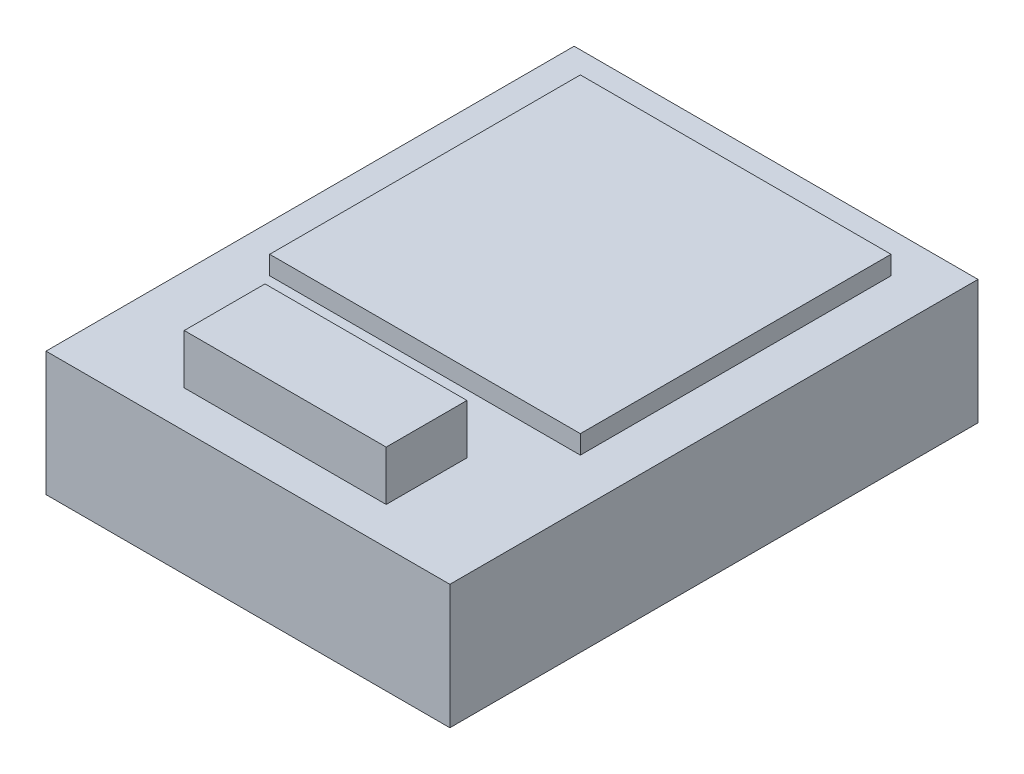
ISO-10303-21;
HEADER;
FILE_DESCRIPTION(('STEP AP214'),'2;1');
FILE_NAME('part.step','',(''),(''),'','','');
FILE_SCHEMA(('AUTOMOTIVE_DESIGN { 1 0 10303 214 1 1 1 1 }'));
ENDSEC;
DATA;
#1=APPLICATION_CONTEXT('core data for automotive mechanical design processes');
#2=APPLICATION_PROTOCOL_DEFINITION('international standard','automotive_design',2000,#1);
#3=PRODUCT_CONTEXT('',#1,'mechanical');
#4=PRODUCT('Part','Part','',(#3));
#5=PRODUCT_RELATED_PRODUCT_CATEGORY('part','',(#4));
#6=PRODUCT_DEFINITION_FORMATION('','',#4);
#7=PRODUCT_DEFINITION_CONTEXT('part definition',#1,'design');
#8=PRODUCT_DEFINITION('design','',#6,#7);
#9=PRODUCT_DEFINITION_SHAPE('','',#8);
#10=(LENGTH_UNIT() NAMED_UNIT(*) SI_UNIT(.MILLI.,.METRE.));
#11=(NAMED_UNIT(*) PLANE_ANGLE_UNIT() SI_UNIT($,.RADIAN.));
#12=(NAMED_UNIT(*) SI_UNIT($,.STERADIAN.) SOLID_ANGLE_UNIT());
#13=UNCERTAINTY_MEASURE_WITH_UNIT(LENGTH_MEASURE(1.E-05),#10,'distance_accuracy_value','');
#14=(GEOMETRIC_REPRESENTATION_CONTEXT(3) GLOBAL_UNCERTAINTY_ASSIGNED_CONTEXT((#13)) GLOBAL_UNIT_ASSIGNED_CONTEXT((#10,
#11,#12)) REPRESENTATION_CONTEXT('',''));
#15=CARTESIAN_POINT('',(0.,0.,0.));
#16=DIRECTION('',(0.,0.,1.));
#17=DIRECTION('',(1.,0.,0.));
#18=AXIS2_PLACEMENT_3D('',#15,#16,#17);
#19=CARTESIAN_POINT('',(-0.418925831202045,0.5,-0.867774936061381));
#20=DIRECTION('',(1.,0.,0.));
#21=DIRECTION('',(0.,0.,-1.));
#22=AXIS2_PLACEMENT_3D('',#19,#20,#21);
#23=PLANE('',#22);
#24=DIRECTION('',(0.,0.,-1.));
#25=VECTOR('',#24,1.);
#26=CARTESIAN_POINT('',(-0.418925831202045,0.1,-0.867774936061381));
#27=LINE('',#26,#25);
#28=CARTESIAN_POINT('',(-0.418925831202045,0.1,0.832225063938618));
#29=VERTEX_POINT('',#28);
#30=CARTESIAN_POINT('',(-0.418925831202045,0.1,-0.867774936061381));
#31=VERTEX_POINT('',#30);
#32=EDGE_CURVE('E57',#29,#31,#27,.T.);
#33=ORIENTED_EDGE('',*,*,#32,.F.);
#34=DIRECTION('',(0.,-1.,0.));
#35=VECTOR('',#34,1.);
#36=CARTESIAN_POINT('',(-0.418925831202045,0.5,0.832225063938618));
#37=LINE('',#36,#35);
#38=CARTESIAN_POINT('',(-0.418925831202045,0.5,0.832225063938618));
#39=VERTEX_POINT('',#38);
#40=EDGE_CURVE('E49',#39,#29,#37,.T.);
#41=ORIENTED_EDGE('',*,*,#40,.F.);
#42=DIRECTION('',(0.,0.,1.));
#43=VECTOR('',#42,1.);
#44=CARTESIAN_POINT('',(-0.418925831202045,0.5,-0.867774936061381));
#45=LINE('',#44,#43);
#46=CARTESIAN_POINT('',(-0.418925831202045,0.5,-0.867774936061381));
#47=VERTEX_POINT('',#46);
#48=EDGE_CURVE('E317',#47,#39,#45,.T.);
#49=ORIENTED_EDGE('',*,*,#48,.F.);
#50=DIRECTION('',(0.,-1.,0.));
#51=VECTOR('',#50,1.);
#52=CARTESIAN_POINT('',(-0.418925831202045,0.5,-0.867774936061381));
#53=LINE('',#52,#51);
#54=EDGE_CURVE('E327',#47,#31,#53,.T.);
#55=ORIENTED_EDGE('',*,*,#54,.T.);
#56=EDGE_LOOP('',(#33,#41,#49,#55));
#57=FACE_BOUND('',#56,.T.);
#58=ADVANCED_FACE('F43',(#57),#23,.F.);
#59=CARTESIAN_POINT('',(-0.418925831202045,0.5,0.832225063938618));
#60=DIRECTION('',(0.,0.,-1.));
#61=DIRECTION('',(-1.,0.,0.));
#62=AXIS2_PLACEMENT_3D('',#59,#60,#61);
#63=PLANE('',#62);
#64=DIRECTION('',(-1.,0.,0.));
#65=VECTOR('',#64,1.);
#66=CARTESIAN_POINT('',(-0.418925831202045,0.1,0.832225063938618));
#67=LINE('',#66,#65);
#68=CARTESIAN_POINT('',(0.881074168797955,0.1,0.832225063938618));
#69=VERTEX_POINT('',#68);
#70=EDGE_CURVE('E255',#69,#29,#67,.T.);
#71=ORIENTED_EDGE('',*,*,#70,.F.);
#72=DIRECTION('',(0.,-1.,0.));
#73=VECTOR('',#72,1.);
#74=CARTESIAN_POINT('',(0.881074168797955,0.5,0.832225063938618));
#75=LINE('',#74,#73);
#76=CARTESIAN_POINT('',(0.881074168797955,0.5,0.832225063938618));
#77=VERTEX_POINT('',#76);
#78=EDGE_CURVE('E331',#77,#69,#75,.T.);
#79=ORIENTED_EDGE('',*,*,#78,.F.);
#80=DIRECTION('',(1.,0.,0.));
#81=VECTOR('',#80,1.);
#82=CARTESIAN_POINT('',(-0.418925831202045,0.5,0.832225063938618));
#83=LINE('',#82,#81);
#84=EDGE_CURVE('E325',#39,#77,#83,.T.);
#85=ORIENTED_EDGE('',*,*,#84,.F.);
#86=ORIENTED_EDGE('',*,*,#40,.T.);
#87=EDGE_LOOP('',(#71,#79,#85,#86));
#88=FACE_BOUND('',#87,.T.);
#89=ADVANCED_FACE('F337',(#88),#63,.F.);
#90=CARTESIAN_POINT('',(0.881074168797955,0.5,-0.867774936061381));
#91=DIRECTION('',(-1.,0.,0.));
#92=DIRECTION('',(0.,0.,1.));
#93=AXIS2_PLACEMENT_3D('',#90,#91,#92);
#94=PLANE('',#93);
#95=DIRECTION('',(0.,0.,1.));
#96=VECTOR('',#95,1.);
#97=CARTESIAN_POINT('',(0.881074168797955,0.1,-0.867774936061381));
#98=LINE('',#97,#96);
#99=CARTESIAN_POINT('',(0.881074168797955,0.1,-0.867774936061381));
#100=VERTEX_POINT('',#99);
#101=EDGE_CURVE('E249',#100,#69,#98,.T.);
#102=ORIENTED_EDGE('',*,*,#101,.F.);
#103=DIRECTION('',(0.,-1.,0.));
#104=VECTOR('',#103,1.);
#105=CARTESIAN_POINT('',(0.881074168797955,0.5,-0.867774936061381));
#106=LINE('',#105,#104);
#107=CARTESIAN_POINT('',(0.881074168797955,0.5,-0.867774936061381));
#108=VERTEX_POINT('',#107);
#109=EDGE_CURVE('E332',#108,#100,#106,.T.);
#110=ORIENTED_EDGE('',*,*,#109,.F.);
#111=DIRECTION('',(0.,0.,-1.));
#112=VECTOR('',#111,1.);
#113=CARTESIAN_POINT('',(0.881074168797955,0.5,-0.867774936061381));
#114=LINE('',#113,#112);
#115=EDGE_CURVE('E322',#77,#108,#114,.T.);
#116=ORIENTED_EDGE('',*,*,#115,.F.);
#117=ORIENTED_EDGE('',*,*,#78,.T.);
#118=EDGE_LOOP('',(#102,#110,#116,#117));
#119=FACE_BOUND('',#118,.T.);
#120=ADVANCED_FACE('F354',(#119),#94,.F.);
#121=CARTESIAN_POINT('',(-0.418925831202045,0.5,-0.867774936061381));
#122=DIRECTION('',(0.,0.,1.));
#123=DIRECTION('',(1.,0.,0.));
#124=AXIS2_PLACEMENT_3D('',#121,#122,#123);
#125=PLANE('',#124);
#126=DIRECTION('',(1.,0.,0.));
#127=VECTOR('',#126,1.);
#128=CARTESIAN_POINT('',(-0.418925831202045,0.1,-0.867774936061381));
#129=LINE('',#128,#127);
#130=EDGE_CURVE('E11',#31,#100,#129,.T.);
#131=ORIENTED_EDGE('',*,*,#130,.F.);
#132=ORIENTED_EDGE('',*,*,#54,.F.);
#133=DIRECTION('',(-1.,0.,0.));
#134=VECTOR('',#133,1.);
#135=CARTESIAN_POINT('',(-0.418925831202045,0.5,-0.867774936061381));
#136=LINE('',#135,#134);
#137=EDGE_CURVE('E326',#108,#47,#136,.T.);
#138=ORIENTED_EDGE('',*,*,#137,.F.);
#139=ORIENTED_EDGE('',*,*,#109,.T.);
#140=EDGE_LOOP('',(#131,#132,#138,#139));
#141=FACE_BOUND('',#140,.T.);
#142=ADVANCED_FACE('F350',(#141),#125,.F.);
#143=CARTESIAN_POINT('',(0.,0.5,0.));
#144=DIRECTION('',(0.,1.,0.));
#145=DIRECTION('',(0.,0.,1.));
#146=AXIS2_PLACEMENT_3D('',#143,#144,#145);
#147=PLANE('',#146);
#148=DIRECTION('',(0.,0.,1.));
#149=VECTOR('',#148,1.);
#150=CARTESIAN_POINT('',(-0.268925831202045,0.5,-0.737774936061381));
#151=LINE('',#150,#149);
#152=CARTESIAN_POINT('',(-0.268925831202045,0.5,-0.737774936061381));
#153=VERTEX_POINT('',#152);
#154=CARTESIAN_POINT('',(-0.268925831202045,0.5,0.262225063938619));
#155=VERTEX_POINT('',#154);
#156=EDGE_CURVE('E288',#153,#155,#151,.T.);
#157=ORIENTED_EDGE('',*,*,#156,.F.);
#158=DIRECTION('',(-1.,0.,0.));
#159=VECTOR('',#158,1.);
#160=CARTESIAN_POINT('',(-0.268925831202045,0.5,-0.737774936061381));
#161=LINE('',#160,#159);
#162=CARTESIAN_POINT('',(0.731074168797955,0.5,-0.737774936061381));
#163=VERTEX_POINT('',#162);
#164=EDGE_CURVE('E292',#163,#153,#161,.T.);
#165=ORIENTED_EDGE('',*,*,#164,.F.);
#166=DIRECTION('',(0.,0.,-1.));
#167=VECTOR('',#166,1.);
#168=CARTESIAN_POINT('',(0.731074168797955,0.5,-0.737774936061381));
#169=LINE('',#168,#167);
#170=CARTESIAN_POINT('',(0.731074168797955,0.5,0.262225063938619));
#171=VERTEX_POINT('',#170);
#172=EDGE_CURVE('E302',#171,#163,#169,.T.);
#173=ORIENTED_EDGE('',*,*,#172,.F.);
#174=DIRECTION('',(1.,0.,0.));
#175=VECTOR('',#174,1.);
#176=CARTESIAN_POINT('',(-0.268925831202045,0.5,0.262225063938619));
#177=LINE('',#176,#175);
#178=EDGE_CURVE('E297',#155,#171,#177,.T.);
#179=ORIENTED_EDGE('',*,*,#178,.F.);
#180=EDGE_LOOP('',(#157,#165,#173,#179));
#181=FACE_BOUND('',#180,.T.);
#182=ORIENTED_EDGE('',*,*,#48,.T.);
#183=ORIENTED_EDGE('',*,*,#84,.T.);
#184=ORIENTED_EDGE('',*,*,#115,.T.);
#185=ORIENTED_EDGE('',*,*,#137,.T.);
#186=EDGE_LOOP('',(#182,#183,#184,#185));
#187=FACE_BOUND('',#186,.T.);
#188=DIRECTION('',(1.,0.,0.));
#189=VECTOR('',#188,1.);
#190=CARTESIAN_POINT('',(-0.0939258312020454,0.5,0.712225063938618));
#191=LINE('',#190,#189);
#192=CARTESIAN_POINT('',(-0.0939258312020454,0.5,0.712225063938618));
#193=VERTEX_POINT('',#192);
#194=CARTESIAN_POINT('',(0.556074168797955,0.5,0.712225063938618));
#195=VERTEX_POINT('',#194);
#196=EDGE_CURVE('E271',#193,#195,#191,.T.);
#197=ORIENTED_EDGE('',*,*,#196,.F.);
#198=DIRECTION('',(0.,0.,1.));
#199=VECTOR('',#198,1.);
#200=CARTESIAN_POINT('',(-0.0939258312020454,0.5,0.452225063938618));
#201=LINE('',#200,#199);
#202=CARTESIAN_POINT('',(-0.0939258312020454,0.5,0.452225063938618));
#203=VERTEX_POINT('',#202);
#204=EDGE_CURVE('E260',#203,#193,#201,.T.);
#205=ORIENTED_EDGE('',*,*,#204,.F.);
#206=DIRECTION('',(-1.,0.,0.));
#207=VECTOR('',#206,1.);
#208=CARTESIAN_POINT('',(-0.0939258312020454,0.5,0.452225063938618));
#209=LINE('',#208,#207);
#210=CARTESIAN_POINT('',(0.556074168797955,0.5,0.452225063938618));
#211=VERTEX_POINT('',#210);
#212=EDGE_CURVE('E265',#211,#203,#209,.T.);
#213=ORIENTED_EDGE('',*,*,#212,.F.);
#214=DIRECTION('',(0.,0.,-1.));
#215=VECTOR('',#214,1.);
#216=CARTESIAN_POINT('',(0.556074168797955,0.5,0.452225063938618));
#217=LINE('',#216,#215);
#218=EDGE_CURVE('E272',#195,#211,#217,.T.);
#219=ORIENTED_EDGE('',*,*,#218,.F.);
#220=EDGE_LOOP('',(#197,#205,#213,#219));
#221=FACE_BOUND('',#220,.T.);
#222=ADVANCED_FACE('F353',(#181,#187,#221),#147,.T.);
#223=CARTESIAN_POINT('',(-0.268925831202045,0.56,-0.737774936061381));
#224=DIRECTION('',(1.,0.,0.));
#225=DIRECTION('',(0.,0.,-1.));
#226=AXIS2_PLACEMENT_3D('',#223,#224,#225);
#227=PLANE('',#226);
#228=ORIENTED_EDGE('',*,*,#156,.T.);
#229=DIRECTION('',(0.,-1.,0.));
#230=VECTOR('',#229,1.);
#231=CARTESIAN_POINT('',(-0.268925831202045,0.56,0.262225063938619));
#232=LINE('',#231,#230);
#233=CARTESIAN_POINT('',(-0.268925831202045,0.56,0.262225063938619));
#234=VERTEX_POINT('',#233);
#235=EDGE_CURVE('E316',#234,#155,#232,.T.);
#236=ORIENTED_EDGE('',*,*,#235,.F.);
#237=DIRECTION('',(0.,0.,1.));
#238=VECTOR('',#237,1.);
#239=CARTESIAN_POINT('',(-0.268925831202045,0.56,-0.737774936061381));
#240=LINE('',#239,#238);
#241=CARTESIAN_POINT('',(-0.268925831202045,0.56,-0.737774936061381));
#242=VERTEX_POINT('',#241);
#243=EDGE_CURVE('E289',#242,#234,#240,.T.);
#244=ORIENTED_EDGE('',*,*,#243,.F.);
#245=DIRECTION('',(0.,-1.,0.));
#246=VECTOR('',#245,1.);
#247=CARTESIAN_POINT('',(-0.268925831202045,0.56,-0.737774936061381));
#248=LINE('',#247,#246);
#249=EDGE_CURVE('E296',#242,#153,#248,.T.);
#250=ORIENTED_EDGE('',*,*,#249,.T.);
#251=EDGE_LOOP('',(#228,#236,#244,#250));
#252=FACE_BOUND('',#251,.T.);
#253=ADVANCED_FACE('F359',(#252),#227,.F.);
#254=CARTESIAN_POINT('',(-0.268925831202045,0.56,0.262225063938619));
#255=DIRECTION('',(0.,0.,-1.));
#256=DIRECTION('',(-1.,0.,0.));
#257=AXIS2_PLACEMENT_3D('',#254,#255,#256);
#258=PLANE('',#257);
#259=ORIENTED_EDGE('',*,*,#178,.T.);
#260=DIRECTION('',(0.,-1.,0.));
#261=VECTOR('',#260,1.);
#262=CARTESIAN_POINT('',(0.731074168797955,0.56,0.262225063938619));
#263=LINE('',#262,#261);
#264=CARTESIAN_POINT('',(0.731074168797955,0.56,0.262225063938619));
#265=VERTEX_POINT('',#264);
#266=EDGE_CURVE('E311',#265,#171,#263,.T.);
#267=ORIENTED_EDGE('',*,*,#266,.F.);
#268=DIRECTION('',(1.,0.,0.));
#269=VECTOR('',#268,1.);
#270=CARTESIAN_POINT('',(-0.268925831202045,0.56,0.262225063938619));
#271=LINE('',#270,#269);
#272=EDGE_CURVE('E286',#234,#265,#271,.T.);
#273=ORIENTED_EDGE('',*,*,#272,.F.);
#274=ORIENTED_EDGE('',*,*,#235,.T.);
#275=EDGE_LOOP('',(#259,#267,#273,#274));
#276=FACE_BOUND('',#275,.T.);
#277=ADVANCED_FACE('F410',(#276),#258,.F.);
#278=CARTESIAN_POINT('',(0.731074168797955,0.56,-0.737774936061381));
#279=DIRECTION('',(-1.,0.,0.));
#280=DIRECTION('',(0.,0.,1.));
#281=AXIS2_PLACEMENT_3D('',#278,#279,#280);
#282=PLANE('',#281);
#283=ORIENTED_EDGE('',*,*,#172,.T.);
#284=DIRECTION('',(0.,-1.,0.));
#285=VECTOR('',#284,1.);
#286=CARTESIAN_POINT('',(0.731074168797955,0.56,-0.737774936061381));
#287=LINE('',#286,#285);
#288=CARTESIAN_POINT('',(0.731074168797955,0.56,-0.737774936061381));
#289=VERTEX_POINT('',#288);
#290=EDGE_CURVE('E309',#289,#163,#287,.T.);
#291=ORIENTED_EDGE('',*,*,#290,.F.);
#292=DIRECTION('',(0.,0.,-1.));
#293=VECTOR('',#292,1.);
#294=CARTESIAN_POINT('',(0.731074168797955,0.56,-0.737774936061381));
#295=LINE('',#294,#293);
#296=EDGE_CURVE('E291',#265,#289,#295,.T.);
#297=ORIENTED_EDGE('',*,*,#296,.F.);
#298=ORIENTED_EDGE('',*,*,#266,.T.);
#299=EDGE_LOOP('',(#283,#291,#297,#298));
#300=FACE_BOUND('',#299,.T.);
#301=ADVANCED_FACE('F414',(#300),#282,.F.);
#302=CARTESIAN_POINT('',(-0.268925831202045,0.56,-0.737774936061381));
#303=DIRECTION('',(0.,0.,1.));
#304=DIRECTION('',(1.,0.,0.));
#305=AXIS2_PLACEMENT_3D('',#302,#303,#304);
#306=PLANE('',#305);
#307=ORIENTED_EDGE('',*,*,#164,.T.);
#308=ORIENTED_EDGE('',*,*,#249,.F.);
#309=DIRECTION('',(-1.,0.,0.));
#310=VECTOR('',#309,1.);
#311=CARTESIAN_POINT('',(-0.268925831202045,0.56,-0.737774936061381));
#312=LINE('',#311,#310);
#313=EDGE_CURVE('E293',#289,#242,#312,.T.);
#314=ORIENTED_EDGE('',*,*,#313,.F.);
#315=ORIENTED_EDGE('',*,*,#290,.T.);
#316=EDGE_LOOP('',(#307,#308,#314,#315));
#317=FACE_BOUND('',#316,.T.);
#318=ADVANCED_FACE('F418',(#317),#306,.F.);
#319=CARTESIAN_POINT('',(0.,0.56,0.));
#320=DIRECTION('',(0.,1.,0.));
#321=DIRECTION('',(0.,0.,1.));
#322=AXIS2_PLACEMENT_3D('',#319,#320,#321);
#323=PLANE('',#322);
#324=ORIENTED_EDGE('',*,*,#243,.T.);
#325=ORIENTED_EDGE('',*,*,#272,.T.);
#326=ORIENTED_EDGE('',*,*,#296,.T.);
#327=ORIENTED_EDGE('',*,*,#313,.T.);
#328=EDGE_LOOP('',(#324,#325,#326,#327));
#329=FACE_BOUND('',#328,.T.);
#330=ADVANCED_FACE('F419',(#329),#323,.T.);
#331=CARTESIAN_POINT('',(-0.0939258312020454,0.66,0.452225063938618));
#332=DIRECTION('',(1.,0.,0.));
#333=DIRECTION('',(0.,0.,-1.));
#334=AXIS2_PLACEMENT_3D('',#331,#332,#333);
#335=PLANE('',#334);
#336=ORIENTED_EDGE('',*,*,#204,.T.);
#337=DIRECTION('',(0.,-1.,0.));
#338=VECTOR('',#337,1.);
#339=CARTESIAN_POINT('',(-0.0939258312020454,0.66,0.712225063938618));
#340=LINE('',#339,#338);
#341=CARTESIAN_POINT('',(-0.0939258312020454,0.66,0.712225063938618));
#342=VERTEX_POINT('',#341);
#343=EDGE_CURVE('E283',#342,#193,#340,.T.);
#344=ORIENTED_EDGE('',*,*,#343,.F.);
#345=DIRECTION('',(0.,0.,1.));
#346=VECTOR('',#345,1.);
#347=CARTESIAN_POINT('',(-0.0939258312020454,0.66,0.452225063938618));
#348=LINE('',#347,#346);
#349=CARTESIAN_POINT('',(-0.0939258312020454,0.66,0.452225063938618));
#350=VERTEX_POINT('',#349);
#351=EDGE_CURVE('E256',#350,#342,#348,.T.);
#352=ORIENTED_EDGE('',*,*,#351,.F.);
#353=DIRECTION('',(0.,-1.,0.));
#354=VECTOR('',#353,1.);
#355=CARTESIAN_POINT('',(-0.0939258312020454,0.66,0.452225063938618));
#356=LINE('',#355,#354);
#357=EDGE_CURVE('E268',#350,#203,#356,.T.);
#358=ORIENTED_EDGE('',*,*,#357,.T.);
#359=EDGE_LOOP('',(#336,#344,#352,#358));
#360=FACE_BOUND('',#359,.T.);
#361=ADVANCED_FACE('F378',(#360),#335,.F.);
#362=CARTESIAN_POINT('',(-0.0939258312020454,0.66,0.712225063938618));
#363=DIRECTION('',(0.,0.,-1.));
#364=DIRECTION('',(-1.,0.,0.));
#365=AXIS2_PLACEMENT_3D('',#362,#363,#364);
#366=PLANE('',#365);
#367=ORIENTED_EDGE('',*,*,#196,.T.);
#368=DIRECTION('',(0.,-1.,0.));
#369=VECTOR('',#368,1.);
#370=CARTESIAN_POINT('',(0.556074168797955,0.66,0.712225063938618));
#371=LINE('',#370,#369);
#372=CARTESIAN_POINT('',(0.556074168797955,0.66,0.712225063938618));
#373=VERTEX_POINT('',#372);
#374=EDGE_CURVE('E284',#373,#195,#371,.T.);
#375=ORIENTED_EDGE('',*,*,#374,.F.);
#376=DIRECTION('',(1.,0.,0.));
#377=VECTOR('',#376,1.);
#378=CARTESIAN_POINT('',(-0.0939258312020454,0.66,0.712225063938618));
#379=LINE('',#378,#377);
#380=EDGE_CURVE('E261',#342,#373,#379,.T.);
#381=ORIENTED_EDGE('',*,*,#380,.F.);
#382=ORIENTED_EDGE('',*,*,#343,.T.);
#383=EDGE_LOOP('',(#367,#375,#381,#382));
#384=FACE_BOUND('',#383,.T.);
#385=ADVANCED_FACE('F368',(#384),#366,.F.);
#386=CARTESIAN_POINT('',(0.556074168797955,0.66,0.452225063938618));
#387=DIRECTION('',(-1.,0.,0.));
#388=DIRECTION('',(0.,0.,1.));
#389=AXIS2_PLACEMENT_3D('',#386,#387,#388);
#390=PLANE('',#389);
#391=ORIENTED_EDGE('',*,*,#218,.T.);
#392=DIRECTION('',(0.,-1.,0.));
#393=VECTOR('',#392,1.);
#394=CARTESIAN_POINT('',(0.556074168797955,0.66,0.452225063938618));
#395=LINE('',#394,#393);
#396=CARTESIAN_POINT('',(0.556074168797955,0.66,0.452225063938618));
#397=VERTEX_POINT('',#396);
#398=EDGE_CURVE('E276',#397,#211,#395,.T.);
#399=ORIENTED_EDGE('',*,*,#398,.F.);
#400=DIRECTION('',(0.,0.,-1.));
#401=VECTOR('',#400,1.);
#402=CARTESIAN_POINT('',(0.556074168797955,0.66,0.452225063938618));
#403=LINE('',#402,#401);
#404=EDGE_CURVE('E262',#373,#397,#403,.T.);
#405=ORIENTED_EDGE('',*,*,#404,.F.);
#406=ORIENTED_EDGE('',*,*,#374,.T.);
#407=EDGE_LOOP('',(#391,#399,#405,#406));
#408=FACE_BOUND('',#407,.T.);
#409=ADVANCED_FACE('F367',(#408),#390,.F.);
#410=CARTESIAN_POINT('',(-0.0939258312020454,0.66,0.452225063938618));
#411=DIRECTION('',(0.,0.,1.));
#412=DIRECTION('',(1.,0.,0.));
#413=AXIS2_PLACEMENT_3D('',#410,#411,#412);
#414=PLANE('',#413);
#415=ORIENTED_EDGE('',*,*,#212,.T.);
#416=ORIENTED_EDGE('',*,*,#357,.F.);
#417=DIRECTION('',(-1.,0.,0.));
#418=VECTOR('',#417,1.);
#419=CARTESIAN_POINT('',(-0.0939258312020454,0.66,0.452225063938618));
#420=LINE('',#419,#418);
#421=EDGE_CURVE('E266',#397,#350,#420,.T.);
#422=ORIENTED_EDGE('',*,*,#421,.F.);
#423=ORIENTED_EDGE('',*,*,#398,.T.);
#424=EDGE_LOOP('',(#415,#416,#422,#423));
#425=FACE_BOUND('',#424,.T.);
#426=ADVANCED_FACE('F379',(#425),#414,.F.);
#427=CARTESIAN_POINT('',(0.,0.66,0.));
#428=DIRECTION('',(0.,1.,0.));
#429=DIRECTION('',(0.,0.,1.));
#430=AXIS2_PLACEMENT_3D('',#427,#428,#429);
#431=PLANE('',#430);
#432=ORIENTED_EDGE('',*,*,#351,.T.);
#433=ORIENTED_EDGE('',*,*,#380,.T.);
#434=ORIENTED_EDGE('',*,*,#404,.T.);
#435=ORIENTED_EDGE('',*,*,#421,.T.);
#436=EDGE_LOOP('',(#432,#433,#434,#435));
#437=FACE_BOUND('',#436,.T.);
#438=ADVANCED_FACE('F372',(#437),#431,.T.);
#439=CARTESIAN_POINT('',(0.,0.1,0.));
#440=DIRECTION('',(0.,-1.,0.));
#441=DIRECTION('',(0.,0.,-1.));
#442=AXIS2_PLACEMENT_3D('',#439,#440,#441);
#443=PLANE('',#442);
#444=DIRECTION('',(-1.,0.,0.));
#445=VECTOR('',#444,1.);
#446=CARTESIAN_POINT('',(-0.293925831202045,0.1,0.732225063938618));
#447=LINE('',#446,#445);
#448=CARTESIAN_POINT('',(0.106074168797955,0.1,0.732225063938618));
#449=VERTEX_POINT('',#448);
#450=CARTESIAN_POINT('',(-0.293925831202045,0.1,0.732225063938618));
#451=VERTEX_POINT('',#450);
#452=EDGE_CURVE('E232',#449,#451,#447,.T.);
#453=ORIENTED_EDGE('',*,*,#452,.F.);
#454=DIRECTION('',(0.,0.,1.));
#455=VECTOR('',#454,1.);
#456=CARTESIAN_POINT('',(0.106074168797955,0.1,0.732225063938618));
#457=LINE('',#456,#455);
#458=CARTESIAN_POINT('',(0.106074168797955,0.1,-0.767774936061382));
#459=VERTEX_POINT('',#458);
#460=EDGE_CURVE('E227',#459,#449,#457,.T.);
#461=ORIENTED_EDGE('',*,*,#460,.F.);
#462=DIRECTION('',(1.,0.,0.));
#463=VECTOR('',#462,1.);
#464=CARTESIAN_POINT('',(-0.293925831202045,0.1,-0.767774936061382));
#465=LINE('',#464,#463);
#466=CARTESIAN_POINT('',(-0.293925831202045,0.1,-0.767774936061382));
#467=VERTEX_POINT('',#466);
#468=EDGE_CURVE('E229',#467,#459,#465,.T.);
#469=ORIENTED_EDGE('',*,*,#468,.F.);
#470=DIRECTION('',(0.,0.,-1.));
#471=VECTOR('',#470,1.);
#472=CARTESIAN_POINT('',(-0.293925831202045,0.1,0.732225063938618));
#473=LINE('',#472,#471);
#474=EDGE_CURVE('E224',#451,#467,#473,.T.);
#475=ORIENTED_EDGE('',*,*,#474,.F.);
#476=EDGE_LOOP('',(#453,#461,#469,#475));
#477=FACE_BOUND('',#476,.T.);
#478=DIRECTION('',(-1.,0.,0.));
#479=VECTOR('',#478,1.);
#480=CARTESIAN_POINT('',(0.356074168797955,0.1,0.732225063938618));
#481=LINE('',#480,#479);
#482=CARTESIAN_POINT('',(0.756074168797955,0.1,0.732225063938618));
#483=VERTEX_POINT('',#482);
#484=CARTESIAN_POINT('',(0.356074168797955,0.1,0.732225063938618));
#485=VERTEX_POINT('',#484);
#486=EDGE_CURVE('E193',#483,#485,#481,.T.);
#487=ORIENTED_EDGE('',*,*,#486,.F.);
#488=DIRECTION('',(0.,0.,1.));
#489=VECTOR('',#488,1.);
#490=CARTESIAN_POINT('',(0.756074168797955,0.1,0.732225063938618));
#491=LINE('',#490,#489);
#492=CARTESIAN_POINT('',(0.756074168797955,0.1,-0.767774936061382));
#493=VERTEX_POINT('',#492);
#494=EDGE_CURVE('E199',#493,#483,#491,.T.);
#495=ORIENTED_EDGE('',*,*,#494,.F.);
#496=DIRECTION('',(1.,0.,0.));
#497=VECTOR('',#496,1.);
#498=CARTESIAN_POINT('',(0.356074168797955,0.1,-0.767774936061382));
#499=LINE('',#498,#497);
#500=CARTESIAN_POINT('',(0.356074168797955,0.1,-0.767774936061382));
#501=VERTEX_POINT('',#500);
#502=EDGE_CURVE('E181',#501,#493,#499,.T.);
#503=ORIENTED_EDGE('',*,*,#502,.F.);
#504=DIRECTION('',(0.,0.,-1.));
#505=VECTOR('',#504,1.);
#506=CARTESIAN_POINT('',(0.356074168797955,0.1,0.732225063938618));
#507=LINE('',#506,#505);
#508=EDGE_CURVE('E197',#485,#501,#507,.T.);
#509=ORIENTED_EDGE('',*,*,#508,.F.);
#510=EDGE_LOOP('',(#487,#495,#503,#509));
#511=FACE_BOUND('',#510,.T.);
#512=ORIENTED_EDGE('',*,*,#32,.T.);
#513=ORIENTED_EDGE('',*,*,#130,.T.);
#514=ORIENTED_EDGE('',*,*,#101,.T.);
#515=ORIENTED_EDGE('',*,*,#70,.T.);
#516=EDGE_LOOP('',(#512,#513,#514,#515));
#517=FACE_BOUND('',#516,.T.);
#518=ADVANCED_FACE('F198',(#477,#511,#517),#443,.T.);
#519=CARTESIAN_POINT('',(-0.293925831202045,0.1,0.732225063938618));
#520=DIRECTION('',(-1.,0.,0.));
#521=DIRECTION('',(0.,0.,1.));
#522=AXIS2_PLACEMENT_3D('',#519,#520,#521);
#523=PLANE('',#522);
#524=DIRECTION('',(0.,0.,-1.));
#525=VECTOR('',#524,1.);
#526=CARTESIAN_POINT('',(-0.293925831202045,0.,0.732225063938618));
#527=LINE('',#526,#525);
#528=CARTESIAN_POINT('',(-0.293925831202045,0.,0.732225063938618));
#529=VERTEX_POINT('',#528);
#530=CARTESIAN_POINT('',(-0.293925831202045,0.,-0.767774936061382));
#531=VERTEX_POINT('',#530);
#532=EDGE_CURVE('E218',#529,#531,#527,.T.);
#533=ORIENTED_EDGE('',*,*,#532,.F.);
#534=DIRECTION('',(0.,-1.,0.));
#535=VECTOR('',#534,1.);
#536=CARTESIAN_POINT('',(-0.293925831202045,0.1,0.732225063938618));
#537=LINE('',#536,#535);
#538=EDGE_CURVE('E242',#451,#529,#537,.T.);
#539=ORIENTED_EDGE('',*,*,#538,.F.);
#540=ORIENTED_EDGE('',*,*,#474,.T.);
#541=DIRECTION('',(0.,-1.,0.));
#542=VECTOR('',#541,1.);
#543=CARTESIAN_POINT('',(-0.293925831202045,0.1,-0.767774936061382));
#544=LINE('',#543,#542);
#545=EDGE_CURVE('E237',#467,#531,#544,.T.);
#546=ORIENTED_EDGE('',*,*,#545,.T.);
#547=EDGE_LOOP('',(#533,#539,#540,#546));
#548=FACE_BOUND('',#547,.T.);
#549=ADVANCED_FACE('F480',(#548),#523,.T.);
#550=CARTESIAN_POINT('',(-0.293925831202045,0.1,0.732225063938618));
#551=DIRECTION('',(0.,0.,1.));
#552=DIRECTION('',(1.,0.,0.));
#553=AXIS2_PLACEMENT_3D('',#550,#551,#552);
#554=PLANE('',#553);
#555=DIRECTION('',(-1.,0.,0.));
#556=VECTOR('',#555,1.);
#557=CARTESIAN_POINT('',(-0.293925831202045,0.,0.732225063938618));
#558=LINE('',#557,#556);
#559=CARTESIAN_POINT('',(0.106074168797955,0.,0.732225063938618));
#560=VERTEX_POINT('',#559);
#561=EDGE_CURVE('E226',#560,#529,#558,.T.);
#562=ORIENTED_EDGE('',*,*,#561,.F.);
#563=DIRECTION('',(0.,-1.,0.));
#564=VECTOR('',#563,1.);
#565=CARTESIAN_POINT('',(0.106074168797955,0.1,0.732225063938618));
#566=LINE('',#565,#564);
#567=EDGE_CURVE('E247',#449,#560,#566,.T.);
#568=ORIENTED_EDGE('',*,*,#567,.F.);
#569=ORIENTED_EDGE('',*,*,#452,.T.);
#570=ORIENTED_EDGE('',*,*,#538,.T.);
#571=EDGE_LOOP('',(#562,#568,#569,#570));
#572=FACE_BOUND('',#571,.T.);
#573=ADVANCED_FACE('F484',(#572),#554,.T.);
#574=CARTESIAN_POINT('',(0.106074168797955,0.1,0.732225063938618));
#575=DIRECTION('',(1.,0.,0.));
#576=DIRECTION('',(0.,0.,-1.));
#577=AXIS2_PLACEMENT_3D('',#574,#575,#576);
#578=PLANE('',#577);
#579=DIRECTION('',(0.,0.,1.));
#580=VECTOR('',#579,1.);
#581=CARTESIAN_POINT('',(0.106074168797955,0.,0.732225063938618));
#582=LINE('',#581,#580);
#583=CARTESIAN_POINT('',(0.106074168797955,0.,-0.767774936061382));
#584=VERTEX_POINT('',#583);
#585=EDGE_CURVE('E63',#584,#560,#582,.T.);
#586=ORIENTED_EDGE('',*,*,#585,.F.);
#587=DIRECTION('',(0.,-1.,0.));
#588=VECTOR('',#587,1.);
#589=CARTESIAN_POINT('',(0.106074168797955,0.1,-0.767774936061382));
#590=LINE('',#589,#588);
#591=EDGE_CURVE('E246',#459,#584,#590,.T.);
#592=ORIENTED_EDGE('',*,*,#591,.F.);
#593=ORIENTED_EDGE('',*,*,#460,.T.);
#594=ORIENTED_EDGE('',*,*,#567,.T.);
#595=EDGE_LOOP('',(#586,#592,#593,#594));
#596=FACE_BOUND('',#595,.T.);
#597=ADVANCED_FACE('F492',(#596),#578,.T.);
#598=CARTESIAN_POINT('',(-0.293925831202045,0.1,-0.767774936061382));
#599=DIRECTION('',(0.,0.,-1.));
#600=DIRECTION('',(-1.,0.,0.));
#601=AXIS2_PLACEMENT_3D('',#598,#599,#600);
#602=PLANE('',#601);
#603=DIRECTION('',(1.,0.,0.));
#604=VECTOR('',#603,1.);
#605=CARTESIAN_POINT('',(-0.293925831202045,0.,-0.767774936061382));
#606=LINE('',#605,#604);
#607=EDGE_CURVE('E239',#531,#584,#606,.T.);
#608=ORIENTED_EDGE('',*,*,#607,.F.);
#609=ORIENTED_EDGE('',*,*,#545,.F.);
#610=ORIENTED_EDGE('',*,*,#468,.T.);
#611=ORIENTED_EDGE('',*,*,#591,.T.);
#612=EDGE_LOOP('',(#608,#609,#610,#611));
#613=FACE_BOUND('',#612,.T.);
#614=ADVANCED_FACE('F504',(#613),#602,.T.);
#615=CARTESIAN_POINT('',(0.356074168797955,0.1,0.732225063938618));
#616=DIRECTION('',(-1.,0.,0.));
#617=DIRECTION('',(0.,0.,1.));
#618=AXIS2_PLACEMENT_3D('',#615,#616,#617);
#619=PLANE('',#618);
#620=DIRECTION('',(0.,0.,-1.));
#621=VECTOR('',#620,1.);
#622=CARTESIAN_POINT('',(0.356074168797955,0.,0.732225063938618));
#623=LINE('',#622,#621);
#624=CARTESIAN_POINT('',(0.356074168797955,0.,0.732225063938618));
#625=VERTEX_POINT('',#624);
#626=CARTESIAN_POINT('',(0.356074168797955,0.,-0.767774936061382));
#627=VERTEX_POINT('',#626);
#628=EDGE_CURVE('E213',#625,#627,#623,.T.);
#629=ORIENTED_EDGE('',*,*,#628,.F.);
#630=DIRECTION('',(0.,-1.,0.));
#631=VECTOR('',#630,1.);
#632=CARTESIAN_POINT('',(0.356074168797955,0.1,0.732225063938618));
#633=LINE('',#632,#631);
#634=EDGE_CURVE('E204',#485,#625,#633,.T.);
#635=ORIENTED_EDGE('',*,*,#634,.F.);
#636=ORIENTED_EDGE('',*,*,#508,.T.);
#637=DIRECTION('',(0.,-1.,0.));
#638=VECTOR('',#637,1.);
#639=CARTESIAN_POINT('',(0.356074168797955,0.1,-0.767774936061382));
#640=LINE('',#639,#638);
#641=EDGE_CURVE('E180',#501,#627,#640,.T.);
#642=ORIENTED_EDGE('',*,*,#641,.T.);
#643=EDGE_LOOP('',(#629,#635,#636,#642));
#644=FACE_BOUND('',#643,.T.);
#645=ADVANCED_FACE('F201',(#644),#619,.T.);
#646=CARTESIAN_POINT('',(0.356074168797955,0.1,0.732225063938618));
#647=DIRECTION('',(0.,0.,1.));
#648=DIRECTION('',(1.,0.,0.));
#649=AXIS2_PLACEMENT_3D('',#646,#647,#648);
#650=PLANE('',#649);
#651=DIRECTION('',(-1.,0.,0.));
#652=VECTOR('',#651,1.);
#653=CARTESIAN_POINT('',(0.356074168797955,0.,0.732225063938618));
#654=LINE('',#653,#652);
#655=CARTESIAN_POINT('',(0.756074168797955,0.,0.732225063938618));
#656=VERTEX_POINT('',#655);
#657=EDGE_CURVE('E202',#656,#625,#654,.T.);
#658=ORIENTED_EDGE('',*,*,#657,.F.);
#659=DIRECTION('',(0.,-1.,0.));
#660=VECTOR('',#659,1.);
#661=CARTESIAN_POINT('',(0.756074168797955,0.1,0.732225063938618));
#662=LINE('',#661,#660);
#663=EDGE_CURVE('E219',#483,#656,#662,.T.);
#664=ORIENTED_EDGE('',*,*,#663,.F.);
#665=ORIENTED_EDGE('',*,*,#486,.T.);
#666=ORIENTED_EDGE('',*,*,#634,.T.);
#667=EDGE_LOOP('',(#658,#664,#665,#666));
#668=FACE_BOUND('',#667,.T.);
#669=ADVANCED_FACE('F513',(#668),#650,.T.);
#670=CARTESIAN_POINT('',(0.756074168797955,0.1,0.732225063938618));
#671=DIRECTION('',(1.,0.,0.));
#672=DIRECTION('',(0.,0.,-1.));
#673=AXIS2_PLACEMENT_3D('',#670,#671,#672);
#674=PLANE('',#673);
#675=DIRECTION('',(0.,0.,1.));
#676=VECTOR('',#675,1.);
#677=CARTESIAN_POINT('',(0.756074168797955,0.,0.732225063938618));
#678=LINE('',#677,#676);
#679=CARTESIAN_POINT('',(0.756074168797955,0.,-0.767774936061382));
#680=VERTEX_POINT('',#679);
#681=EDGE_CURVE('E208',#680,#656,#678,.T.);
#682=ORIENTED_EDGE('',*,*,#681,.F.);
#683=DIRECTION('',(0.,-1.,0.));
#684=VECTOR('',#683,1.);
#685=CARTESIAN_POINT('',(0.756074168797955,0.1,-0.767774936061382));
#686=LINE('',#685,#684);
#687=EDGE_CURVE('E187',#493,#680,#686,.T.);
#688=ORIENTED_EDGE('',*,*,#687,.F.);
#689=ORIENTED_EDGE('',*,*,#494,.T.);
#690=ORIENTED_EDGE('',*,*,#663,.T.);
#691=EDGE_LOOP('',(#682,#688,#689,#690));
#692=FACE_BOUND('',#691,.T.);
#693=ADVANCED_FACE('F524',(#692),#674,.T.);
#694=CARTESIAN_POINT('',(0.356074168797955,0.1,-0.767774936061382));
#695=DIRECTION('',(0.,0.,-1.));
#696=DIRECTION('',(-1.,0.,0.));
#697=AXIS2_PLACEMENT_3D('',#694,#695,#696);
#698=PLANE('',#697);
#699=DIRECTION('',(1.,0.,0.));
#700=VECTOR('',#699,1.);
#701=CARTESIAN_POINT('',(0.356074168797955,0.,-0.767774936061382));
#702=LINE('',#701,#700);
#703=EDGE_CURVE('E183',#627,#680,#702,.T.);
#704=ORIENTED_EDGE('',*,*,#703,.F.);
#705=ORIENTED_EDGE('',*,*,#641,.F.);
#706=ORIENTED_EDGE('',*,*,#502,.T.);
#707=ORIENTED_EDGE('',*,*,#687,.T.);
#708=EDGE_LOOP('',(#704,#705,#706,#707));
#709=FACE_BOUND('',#708,.T.);
#710=ADVANCED_FACE('F182',(#709),#698,.T.);
#711=CARTESIAN_POINT('',(0.,0.,0.));
#712=DIRECTION('',(0.,1.,0.));
#713=DIRECTION('',(0.,0.,1.));
#714=AXIS2_PLACEMENT_3D('',#711,#712,#713);
#715=PLANE('',#714);
#716=ORIENTED_EDGE('',*,*,#532,.T.);
#717=ORIENTED_EDGE('',*,*,#607,.T.);
#718=ORIENTED_EDGE('',*,*,#585,.T.);
#719=ORIENTED_EDGE('',*,*,#561,.T.);
#720=EDGE_LOOP('',(#716,#717,#718,#719));
#721=FACE_BOUND('',#720,.T.);
#722=ADVANCED_FACE('F402',(#721),#715,.F.);
#723=ORIENTED_EDGE('',*,*,#628,.T.);
#724=ORIENTED_EDGE('',*,*,#703,.T.);
#725=ORIENTED_EDGE('',*,*,#681,.T.);
#726=ORIENTED_EDGE('',*,*,#657,.T.);
#727=EDGE_LOOP('',(#723,#724,#725,#726));
#728=FACE_BOUND('',#727,.T.);
#729=ADVANCED_FACE('F401',(#728),#715,.F.);
#730=CLOSED_SHELL('',(#58,#89,#120,#142,#222,#253,#277,#301,#318,#330,#361,#385,#409,#426,#438,
#518,#549,#573,#597,#614,#645,#669,#693,#710,#722,#729));
#731=MANIFOLD_SOLID_BREP('B2',#730);
#732=ADVANCED_BREP_SHAPE_REPRESENTATION('',(#18,#731),#14);
#733=SHAPE_DEFINITION_REPRESENTATION(#9,#732);
ENDSEC;
END-ISO-10303-21;
